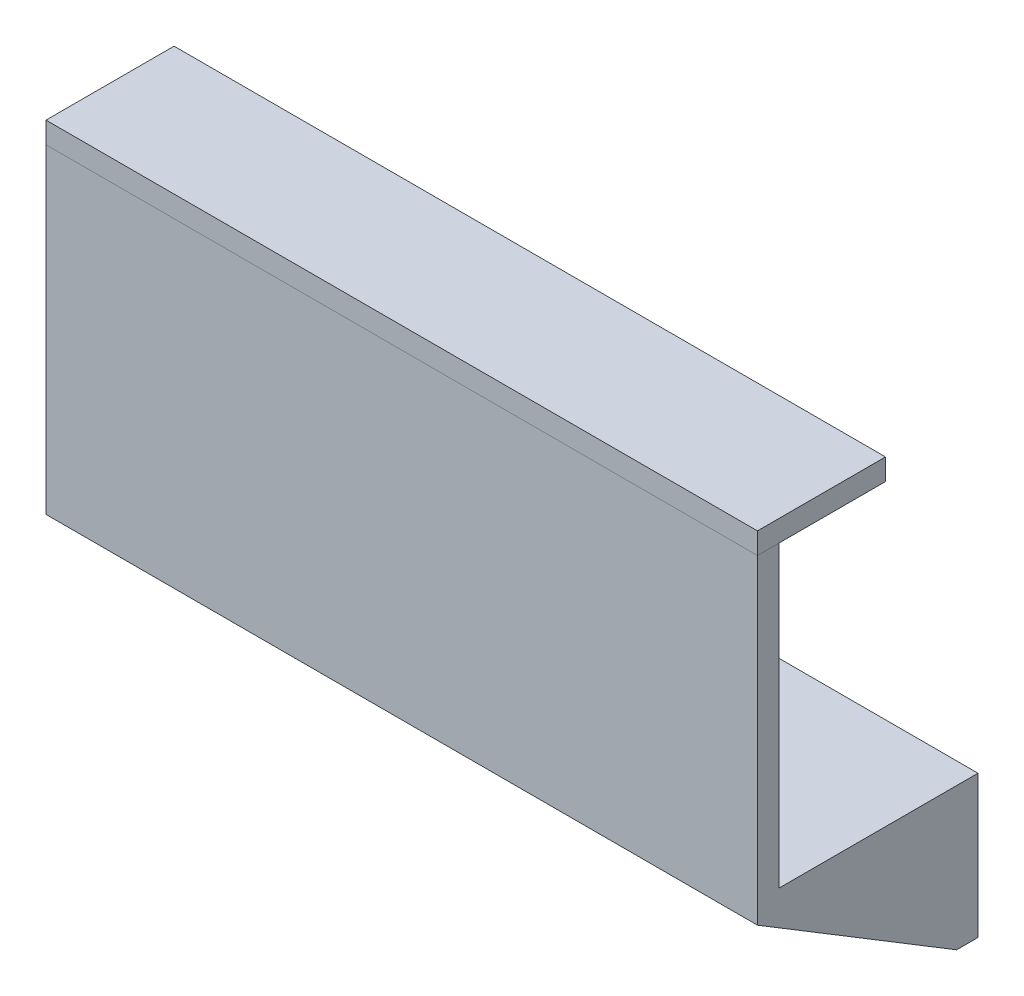
ISO-10303-21;
HEADER;
FILE_DESCRIPTION(('STEP AP214'),'2;1');
FILE_NAME('part.step','',(''),(''),'','','');
FILE_SCHEMA(('AUTOMOTIVE_DESIGN { 1 0 10303 214 1 1 1 1 }'));
ENDSEC;
DATA;
#1=APPLICATION_CONTEXT('core data for automotive mechanical design processes');
#2=APPLICATION_PROTOCOL_DEFINITION('international standard','automotive_design',2000,#1);
#3=PRODUCT_CONTEXT('',#1,'mechanical');
#4=PRODUCT('Part','Part','',(#3));
#5=PRODUCT_RELATED_PRODUCT_CATEGORY('part','',(#4));
#6=PRODUCT_DEFINITION_FORMATION('','',#4);
#7=PRODUCT_DEFINITION_CONTEXT('part definition',#1,'design');
#8=PRODUCT_DEFINITION('design','',#6,#7);
#9=PRODUCT_DEFINITION_SHAPE('','',#8);
#10=(LENGTH_UNIT() NAMED_UNIT(*) SI_UNIT(.MILLI.,.METRE.));
#11=(NAMED_UNIT(*) PLANE_ANGLE_UNIT() SI_UNIT($,.RADIAN.));
#12=(NAMED_UNIT(*) SI_UNIT($,.STERADIAN.) SOLID_ANGLE_UNIT());
#13=UNCERTAINTY_MEASURE_WITH_UNIT(LENGTH_MEASURE(1.E-05),#10,'distance_accuracy_value','');
#14=(GEOMETRIC_REPRESENTATION_CONTEXT(3) GLOBAL_UNCERTAINTY_ASSIGNED_CONTEXT((#13)) GLOBAL_UNIT_ASSIGNED_CONTEXT((#10,
#11,#12)) REPRESENTATION_CONTEXT('',''));
#15=CARTESIAN_POINT('',(0.,0.,0.));
#16=DIRECTION('',(0.,0.,1.));
#17=DIRECTION('',(1.,0.,0.));
#18=AXIS2_PLACEMENT_3D('',#15,#16,#17);
#19=CARTESIAN_POINT('',(2.,-3.,3.));
#20=DIRECTION('',(0.,0.,-1.));
#21=DIRECTION('',(-1.,0.,0.));
#22=AXIS2_PLACEMENT_3D('',#19,#20,#21);
#23=PLANE('',#22);
#24=DIRECTION('',(0.,-1.,0.));
#25=VECTOR('',#24,1.);
#26=CARTESIAN_POINT('',(0.,-3.,3.));
#27=LINE('',#26,#25);
#28=CARTESIAN_POINT('',(0.,-3.,3.));
#29=VERTEX_POINT('',#28);
#30=CARTESIAN_POINT('',(0.,-20.,3.));
#31=VERTEX_POINT('',#30);
#32=EDGE_CURVE('E104',#29,#31,#27,.T.);
#33=ORIENTED_EDGE('',*,*,#32,.F.);
#34=DIRECTION('',(-1.,0.,0.));
#35=VECTOR('',#34,1.);
#36=CARTESIAN_POINT('',(2.,-3.,3.));
#37=LINE('',#36,#35);
#38=CARTESIAN_POINT('',(2.,-3.,3.));
#39=VERTEX_POINT('',#38);
#40=EDGE_CURVE('E12',#39,#29,#37,.T.);
#41=ORIENTED_EDGE('',*,*,#40,.F.);
#42=DIRECTION('',(0.,-1.,0.));
#43=VECTOR('',#42,1.);
#44=CARTESIAN_POINT('',(2.,-3.,3.));
#45=LINE('',#44,#43);
#46=CARTESIAN_POINT('',(2.,-20.,3.));
#47=VERTEX_POINT('',#46);
#48=EDGE_CURVE('E96',#39,#47,#45,.T.);
#49=ORIENTED_EDGE('',*,*,#48,.T.);
#50=DIRECTION('',(-1.,0.,0.));
#51=VECTOR('',#50,1.);
#52=CARTESIAN_POINT('',(2.,-20.,3.));
#53=LINE('',#52,#51);
#54=EDGE_CURVE('E55',#47,#31,#53,.T.);
#55=ORIENTED_EDGE('',*,*,#54,.T.);
#56=EDGE_LOOP('',(#33,#41,#49,#55));
#57=FACE_BOUND('',#56,.T.);
#58=ADVANCED_FACE('F52',(#57),#23,.T.);
#59=CARTESIAN_POINT('',(2.,-3.,31.));
#60=DIRECTION('',(0.,1.,0.));
#61=DIRECTION('',(-1.,0.,0.));
#62=AXIS2_PLACEMENT_3D('',#59,#60,#61);
#63=PLANE('',#62);
#64=DIRECTION('',(0.,0.,-1.));
#65=VECTOR('',#64,1.);
#66=CARTESIAN_POINT('',(0.,-3.,31.));
#67=LINE('',#66,#65);
#68=CARTESIAN_POINT('',(0.,-3.,31.));
#69=VERTEX_POINT('',#68);
#70=EDGE_CURVE('E98',#69,#29,#67,.T.);
#71=ORIENTED_EDGE('',*,*,#70,.F.);
#72=DIRECTION('',(-1.,0.,0.));
#73=VECTOR('',#72,1.);
#74=CARTESIAN_POINT('',(2.,-3.,31.));
#75=LINE('',#74,#73);
#76=CARTESIAN_POINT('',(2.,-3.,31.));
#77=VERTEX_POINT('',#76);
#78=EDGE_CURVE('E61',#77,#69,#75,.T.);
#79=ORIENTED_EDGE('',*,*,#78,.F.);
#80=DIRECTION('',(0.,0.,-1.));
#81=VECTOR('',#80,1.);
#82=CARTESIAN_POINT('',(2.,-3.,31.));
#83=LINE('',#82,#81);
#84=EDGE_CURVE('E93',#77,#39,#83,.T.);
#85=ORIENTED_EDGE('',*,*,#84,.T.);
#86=ORIENTED_EDGE('',*,*,#40,.T.);
#87=EDGE_LOOP('',(#71,#79,#85,#86));
#88=FACE_BOUND('',#87,.T.);
#89=ADVANCED_FACE('F108',(#88),#63,.T.);
#90=CARTESIAN_POINT('',(2.,-20.,3.));
#91=DIRECTION('',(0.,-0.854787515221729,0.518978134241764));
#92=DIRECTION('',(0.,-0.518978134241764,-0.854787515221729));
#93=AXIS2_PLACEMENT_3D('',#90,#91,#92);
#94=PLANE('',#93);
#95=DIRECTION('',(0.,0.518978134241764,0.854787515221729));
#96=VECTOR('',#95,1.);
#97=CARTESIAN_POINT('',(0.,-20.,3.));
#98=LINE('',#97,#96);
#99=EDGE_CURVE('E91',#31,#69,#98,.T.);
#100=ORIENTED_EDGE('',*,*,#99,.F.);
#101=ORIENTED_EDGE('',*,*,#54,.F.);
#102=DIRECTION('',(0.,0.518978134241764,0.854787515221729));
#103=VECTOR('',#102,1.);
#104=CARTESIAN_POINT('',(2.,-20.,3.));
#105=LINE('',#104,#103);
#106=EDGE_CURVE('E89',#47,#77,#105,.T.);
#107=ORIENTED_EDGE('',*,*,#106,.T.);
#108=ORIENTED_EDGE('',*,*,#78,.T.);
#109=EDGE_LOOP('',(#100,#101,#107,#108));
#110=FACE_BOUND('',#109,.T.);
#111=ADVANCED_FACE('F88',(#110),#94,.T.);
#112=CARTESIAN_POINT('',(2.,0.,0.));
#113=DIRECTION('',(1.,0.,0.));
#114=DIRECTION('',(0.,1.,0.));
#115=AXIS2_PLACEMENT_3D('',#112,#113,#114);
#116=PLANE('',#115);
#117=ORIENTED_EDGE('',*,*,#48,.F.);
#118=ORIENTED_EDGE('',*,*,#84,.F.);
#119=ORIENTED_EDGE('',*,*,#106,.F.);
#120=EDGE_LOOP('',(#117,#118,#119));
#121=FACE_BOUND('',#120,.T.);
#122=ADVANCED_FACE('F95',(#121),#116,.T.);
#123=CARTESIAN_POINT('',(0.,0.,0.));
#124=DIRECTION('',(1.,0.,0.));
#125=DIRECTION('',(0.,1.,0.));
#126=AXIS2_PLACEMENT_3D('',#123,#124,#125);
#127=PLANE('',#126);
#128=ORIENTED_EDGE('',*,*,#32,.T.);
#129=ORIENTED_EDGE('',*,*,#99,.T.);
#130=ORIENTED_EDGE('',*,*,#70,.T.);
#131=EDGE_LOOP('',(#128,#129,#130));
#132=FACE_BOUND('',#131,.T.);
#133=ADVANCED_FACE('F107',(#132),#127,.F.);
#134=CLOSED_SHELL('',(#58,#89,#111,#122,#133));
#135=MANIFOLD_SOLID_BREP('B2',#134);
#136=CARTESIAN_POINT('',(100.,42.,31.));
#137=DIRECTION('',(1.,0.,0.));
#138=DIRECTION('',(0.,0.,-1.));
#139=AXIS2_PLACEMENT_3D('',#136,#137,#138);
#140=PLANE('',#139);
#141=DIRECTION('',(0.,0.,-1.));
#142=VECTOR('',#141,1.);
#143=CARTESIAN_POINT('',(100.,42.,31.));
#144=LINE('',#143,#142);
#145=CARTESIAN_POINT('',(100.,42.,31.));
#146=VERTEX_POINT('',#145);
#147=CARTESIAN_POINT('',(100.,42.,13.));
#148=VERTEX_POINT('',#147);
#149=EDGE_CURVE('E152',#146,#148,#144,.T.);
#150=ORIENTED_EDGE('',*,*,#149,.T.);
#151=DIRECTION('',(0.,-1.,0.));
#152=VECTOR('',#151,1.);
#153=CARTESIAN_POINT('',(100.,42.,13.));
#154=LINE('',#153,#152);
#155=CARTESIAN_POINT('',(100.,45.,13.));
#156=VERTEX_POINT('',#155);
#157=EDGE_CURVE('E189',#156,#148,#154,.T.);
#158=ORIENTED_EDGE('',*,*,#157,.F.);
#159=DIRECTION('',(0.,0.,-1.));
#160=VECTOR('',#159,1.);
#161=CARTESIAN_POINT('',(100.,45.,31.));
#162=LINE('',#161,#160);
#163=CARTESIAN_POINT('',(100.,45.,31.));
#164=VERTEX_POINT('',#163);
#165=EDGE_CURVE('E50',#164,#156,#162,.T.);
#166=ORIENTED_EDGE('',*,*,#165,.F.);
#167=DIRECTION('',(0.,-1.,0.));
#168=VECTOR('',#167,1.);
#169=CARTESIAN_POINT('',(100.,42.,31.));
#170=LINE('',#169,#168);
#171=EDGE_CURVE('E190',#164,#146,#170,.T.);
#172=ORIENTED_EDGE('',*,*,#171,.T.);
#173=EDGE_LOOP('',(#150,#158,#166,#172));
#174=FACE_BOUND('',#173,.T.);
#175=ADVANCED_FACE('F149',(#174),#140,.T.);
#176=CARTESIAN_POINT('',(100.,45.,31.));
#177=DIRECTION('',(0.,1.,0.));
#178=DIRECTION('',(-1.,0.,0.));
#179=AXIS2_PLACEMENT_3D('',#176,#177,#178);
#180=PLANE('',#179);
#181=ORIENTED_EDGE('',*,*,#165,.T.);
#182=DIRECTION('',(1.,0.,0.));
#183=VECTOR('',#182,1.);
#184=CARTESIAN_POINT('',(100.,45.,13.));
#185=LINE('',#184,#183);
#186=CARTESIAN_POINT('',(0.,45.,13.));
#187=VERTEX_POINT('',#186);
#188=EDGE_CURVE('E206',#187,#156,#185,.T.);
#189=ORIENTED_EDGE('',*,*,#188,.F.);
#190=DIRECTION('',(0.,0.,-1.));
#191=VECTOR('',#190,1.);
#192=CARTESIAN_POINT('',(0.,45.,31.));
#193=LINE('',#192,#191);
#194=CARTESIAN_POINT('',(0.,45.,31.));
#195=VERTEX_POINT('',#194);
#196=EDGE_CURVE('E157',#195,#187,#193,.T.);
#197=ORIENTED_EDGE('',*,*,#196,.F.);
#198=DIRECTION('',(1.,0.,0.));
#199=VECTOR('',#198,1.);
#200=CARTESIAN_POINT('',(100.,45.,31.));
#201=LINE('',#200,#199);
#202=EDGE_CURVE('E195',#195,#164,#201,.T.);
#203=ORIENTED_EDGE('',*,*,#202,.T.);
#204=EDGE_LOOP('',(#181,#189,#197,#203));
#205=FACE_BOUND('',#204,.T.);
#206=ADVANCED_FACE('F221',(#205),#180,.T.);
#207=CARTESIAN_POINT('',(0.,42.,31.));
#208=DIRECTION('',(-1.,0.,0.));
#209=DIRECTION('',(0.,-1.,0.));
#210=AXIS2_PLACEMENT_3D('',#207,#208,#209);
#211=PLANE('',#210);
#212=ORIENTED_EDGE('',*,*,#196,.T.);
#213=DIRECTION('',(0.,1.,0.));
#214=VECTOR('',#213,1.);
#215=CARTESIAN_POINT('',(0.,42.,13.));
#216=LINE('',#215,#214);
#217=CARTESIAN_POINT('',(0.,42.,13.));
#218=VERTEX_POINT('',#217);
#219=EDGE_CURVE('E202',#218,#187,#216,.T.);
#220=ORIENTED_EDGE('',*,*,#219,.F.);
#221=DIRECTION('',(0.,0.,-1.));
#222=VECTOR('',#221,1.);
#223=CARTESIAN_POINT('',(0.,42.,31.));
#224=LINE('',#223,#222);
#225=CARTESIAN_POINT('',(0.,42.,31.));
#226=VERTEX_POINT('',#225);
#227=EDGE_CURVE('E194',#226,#218,#224,.T.);
#228=ORIENTED_EDGE('',*,*,#227,.F.);
#229=DIRECTION('',(0.,1.,0.));
#230=VECTOR('',#229,1.);
#231=CARTESIAN_POINT('',(0.,42.,31.));
#232=LINE('',#231,#230);
#233=EDGE_CURVE('E214',#226,#195,#232,.T.);
#234=ORIENTED_EDGE('',*,*,#233,.T.);
#235=EDGE_LOOP('',(#212,#220,#228,#234));
#236=FACE_BOUND('',#235,.T.);
#237=ADVANCED_FACE('F218',(#236),#211,.T.);
#238=CARTESIAN_POINT('',(100.,42.,31.));
#239=DIRECTION('',(0.,-1.,0.));
#240=DIRECTION('',(1.,0.,0.));
#241=AXIS2_PLACEMENT_3D('',#238,#239,#240);
#242=PLANE('',#241);
#243=ORIENTED_EDGE('',*,*,#227,.T.);
#244=DIRECTION('',(-1.,0.,0.));
#245=VECTOR('',#244,1.);
#246=CARTESIAN_POINT('',(100.,42.,13.));
#247=LINE('',#246,#245);
#248=EDGE_CURVE('E197',#148,#218,#247,.T.);
#249=ORIENTED_EDGE('',*,*,#248,.F.);
#250=ORIENTED_EDGE('',*,*,#149,.F.);
#251=DIRECTION('',(-1.,0.,0.));
#252=VECTOR('',#251,1.);
#253=CARTESIAN_POINT('',(100.,42.,31.));
#254=LINE('',#253,#252);
#255=EDGE_CURVE('E212',#146,#226,#254,.T.);
#256=ORIENTED_EDGE('',*,*,#255,.T.);
#257=EDGE_LOOP('',(#243,#249,#250,#256));
#258=FACE_BOUND('',#257,.T.);
#259=ADVANCED_FACE('F198',(#258),#242,.T.);
#260=CARTESIAN_POINT('',(0.,0.,31.));
#261=DIRECTION('',(0.,0.,1.));
#262=DIRECTION('',(1.,0.,0.));
#263=AXIS2_PLACEMENT_3D('',#260,#261,#262);
#264=PLANE('',#263);
#265=ORIENTED_EDGE('',*,*,#171,.F.);
#266=ORIENTED_EDGE('',*,*,#202,.F.);
#267=ORIENTED_EDGE('',*,*,#233,.F.);
#268=ORIENTED_EDGE('',*,*,#255,.F.);
#269=EDGE_LOOP('',(#265,#266,#267,#268));
#270=FACE_BOUND('',#269,.T.);
#271=ADVANCED_FACE('F223',(#270),#264,.T.);
#272=CARTESIAN_POINT('',(0.,0.,13.));
#273=DIRECTION('',(0.,0.,1.));
#274=DIRECTION('',(1.,0.,0.));
#275=AXIS2_PLACEMENT_3D('',#272,#273,#274);
#276=PLANE('',#275);
#277=ORIENTED_EDGE('',*,*,#157,.T.);
#278=ORIENTED_EDGE('',*,*,#248,.T.);
#279=ORIENTED_EDGE('',*,*,#219,.T.);
#280=ORIENTED_EDGE('',*,*,#188,.T.);
#281=EDGE_LOOP('',(#277,#278,#279,#280));
#282=FACE_BOUND('',#281,.T.);
#283=ADVANCED_FACE('F205',(#282),#276,.F.);
#284=CLOSED_SHELL('',(#175,#206,#237,#259,#271,#283));
#285=MANIFOLD_SOLID_BREP('B6',#284);
#286=CARTESIAN_POINT('',(0.,0.,3.));
#287=DIRECTION('',(0.,0.,1.));
#288=DIRECTION('',(1.,0.,0.));
#289=AXIS2_PLACEMENT_3D('',#286,#287,#288);
#290=PLANE('',#289);
#291=CARTESIAN_POINT('',(89.,-6.,3.));
#292=DIRECTION('',(0.,0.,1.));
#293=DIRECTION('',(1.,0.,0.));
#294=AXIS2_PLACEMENT_3D('',#291,#292,#293);
#295=CIRCLE('',#294,1.99999999999997);
#296=CARTESIAN_POINT('',(91.,-6.,3.));
#297=VERTEX_POINT('',#296);
#298=EDGE_CURVE('E270',#297,#297,#295,.F.);
#299=ORIENTED_EDGE('',*,*,#298,.T.);
#300=EDGE_LOOP('',(#299));
#301=FACE_BOUND('',#300,.T.);
#302=CARTESIAN_POINT('',(10.,-6.,3.));
#303=DIRECTION('',(0.,0.,1.));
#304=DIRECTION('',(1.,0.,0.));
#305=AXIS2_PLACEMENT_3D('',#302,#303,#304);
#306=CIRCLE('',#305,1.99999999999998);
#307=CARTESIAN_POINT('',(12.,-6.,3.));
#308=VERTEX_POINT('',#307);
#309=EDGE_CURVE('E349',#308,#308,#306,.F.);
#310=ORIENTED_EDGE('',*,*,#309,.T.);
#311=EDGE_LOOP('',(#310));
#312=FACE_BOUND('',#311,.T.);
#313=DIRECTION('',(1.,0.,0.));
#314=VECTOR('',#313,1.);
#315=CARTESIAN_POINT('',(0.,-20.,3.));
#316=LINE('',#315,#314);
#317=CARTESIAN_POINT('',(0.,-20.,3.));
#318=VERTEX_POINT('',#317);
#319=CARTESIAN_POINT('',(98.,-20.,3.));
#320=VERTEX_POINT('',#319);
#321=EDGE_CURVE('E329',#318,#320,#316,.T.);
#322=ORIENTED_EDGE('',*,*,#321,.T.);
#323=DIRECTION('',(0.,1.,0.));
#324=VECTOR('',#323,1.);
#325=CARTESIAN_POINT('',(98.,-20.,3.));
#326=LINE('',#325,#324);
#327=CARTESIAN_POINT('',(98.,-3.,3.));
#328=VERTEX_POINT('',#327);
#329=EDGE_CURVE('E420',#320,#328,#326,.T.);
#330=ORIENTED_EDGE('',*,*,#329,.T.);
#331=DIRECTION('',(1.,0.,0.));
#332=VECTOR('',#331,1.);
#333=CARTESIAN_POINT('',(0.,-3.,3.));
#334=LINE('',#333,#332);
#335=CARTESIAN_POINT('',(0.,-3.,3.));
#336=VERTEX_POINT('',#335);
#337=EDGE_CURVE('E277',#336,#328,#334,.T.);
#338=ORIENTED_EDGE('',*,*,#337,.F.);
#339=DIRECTION('',(0.,-1.,0.));
#340=VECTOR('',#339,1.);
#341=CARTESIAN_POINT('',(0.,0.,3.));
#342=LINE('',#341,#340);
#343=EDGE_CURVE('E282',#336,#318,#342,.T.);
#344=ORIENTED_EDGE('',*,*,#343,.T.);
#345=EDGE_LOOP('',(#322,#330,#338,#344));
#346=FACE_BOUND('',#345,.T.);
#347=ADVANCED_FACE('F261',(#301,#312,#346),#290,.T.);
#348=CARTESIAN_POINT('',(0.,-3.,28.));
#349=DIRECTION('',(0.,1.,0.));
#350=DIRECTION('',(0.,0.,1.));
#351=AXIS2_PLACEMENT_3D('',#348,#349,#350);
#352=PLANE('',#351);
#353=DIRECTION('',(0.,0.,1.));
#354=VECTOR('',#353,1.);
#355=CARTESIAN_POINT('',(98.,-3.,3.));
#356=LINE('',#355,#354);
#357=CARTESIAN_POINT('',(98.,-3.,31.));
#358=VERTEX_POINT('',#357);
#359=EDGE_CURVE('E418',#328,#358,#356,.T.);
#360=ORIENTED_EDGE('',*,*,#359,.T.);
#361=DIRECTION('',(1.,0.,0.));
#362=VECTOR('',#361,1.);
#363=CARTESIAN_POINT('',(100.,-3.,31.));
#364=LINE('',#363,#362);
#365=CARTESIAN_POINT('',(0.,-3.,31.));
#366=VERTEX_POINT('',#365);
#367=EDGE_CURVE('E432',#366,#358,#364,.T.);
#368=ORIENTED_EDGE('',*,*,#367,.F.);
#369=DIRECTION('',(0.,0.,-1.));
#370=VECTOR('',#369,1.);
#371=CARTESIAN_POINT('',(0.,-3.,28.));
#372=LINE('',#371,#370);
#373=EDGE_CURVE('E463',#366,#336,#372,.T.);
#374=ORIENTED_EDGE('',*,*,#373,.T.);
#375=ORIENTED_EDGE('',*,*,#337,.T.);
#376=EDGE_LOOP('',(#360,#368,#374,#375));
#377=FACE_BOUND('',#376,.T.);
#378=ADVANCED_FACE('F384',(#377),#352,.F.);
#379=CARTESIAN_POINT('',(0.,0.,3.));
#380=DIRECTION('',(1.,0.,0.));
#381=DIRECTION('',(0.,1.,0.));
#382=AXIS2_PLACEMENT_3D('',#379,#380,#381);
#383=PLANE('',#382);
#384=DIRECTION('',(0.,-1.,0.));
#385=VECTOR('',#384,1.);
#386=CARTESIAN_POINT('',(0.,0.,0.));
#387=LINE('',#386,#385);
#388=CARTESIAN_POINT('',(0.,0.,0.));
#389=VERTEX_POINT('',#388);
#390=CARTESIAN_POINT('',(0.,-20.,0.));
#391=VERTEX_POINT('',#390);
#392=EDGE_CURVE('E327',#389,#391,#387,.T.);
#393=ORIENTED_EDGE('',*,*,#392,.T.);
#394=DIRECTION('',(0.,0.,-1.));
#395=VECTOR('',#394,1.);
#396=CARTESIAN_POINT('',(0.,-20.,3.));
#397=LINE('',#396,#395);
#398=EDGE_CURVE('E335',#318,#391,#397,.T.);
#399=ORIENTED_EDGE('',*,*,#398,.F.);
#400=ORIENTED_EDGE('',*,*,#343,.F.);
#401=ORIENTED_EDGE('',*,*,#373,.F.);
#402=DIRECTION('',(0.,-1.,0.));
#403=VECTOR('',#402,1.);
#404=CARTESIAN_POINT('',(0.,-3.,31.));
#405=LINE('',#404,#403);
#406=CARTESIAN_POINT('',(0.,42.,31.));
#407=VERTEX_POINT('',#406);
#408=EDGE_CURVE('E442',#407,#366,#405,.T.);
#409=ORIENTED_EDGE('',*,*,#408,.F.);
#410=DIRECTION('',(0.,0.,-1.));
#411=VECTOR('',#410,1.);
#412=CARTESIAN_POINT('',(0.,42.,31.));
#413=LINE('',#412,#411);
#414=CARTESIAN_POINT('',(0.,42.,28.));
#415=VERTEX_POINT('',#414);
#416=EDGE_CURVE('E443',#407,#415,#413,.T.);
#417=ORIENTED_EDGE('',*,*,#416,.T.);
#418=DIRECTION('',(0.,-1.,0.));
#419=VECTOR('',#418,1.);
#420=CARTESIAN_POINT('',(0.,-3.,28.));
#421=LINE('',#420,#419);
#422=CARTESIAN_POINT('',(0.,0.,28.));
#423=VERTEX_POINT('',#422);
#424=EDGE_CURVE('E456',#415,#423,#421,.T.);
#425=ORIENTED_EDGE('',*,*,#424,.T.);
#426=DIRECTION('',(0.,0.,-1.));
#427=VECTOR('',#426,1.);
#428=CARTESIAN_POINT('',(0.,0.,3.));
#429=LINE('',#428,#427);
#430=EDGE_CURVE('E322',#423,#389,#429,.T.);
#431=ORIENTED_EDGE('',*,*,#430,.T.);
#432=EDGE_LOOP('',(#393,#399,#400,#401,#409,#417,#425,#431));
#433=FACE_BOUND('',#432,.T.);
#434=ADVANCED_FACE('F389',(#433),#383,.F.);
#435=CARTESIAN_POINT('',(0.,-20.,3.));
#436=DIRECTION('',(0.,1.,0.));
#437=DIRECTION('',(0.,0.,1.));
#438=AXIS2_PLACEMENT_3D('',#435,#436,#437);
#439=PLANE('',#438);
#440=DIRECTION('',(1.,0.,0.));
#441=VECTOR('',#440,1.);
#442=CARTESIAN_POINT('',(0.,-20.,0.));
#443=LINE('',#442,#441);
#444=CARTESIAN_POINT('',(100.,-20.,0.));
#445=VERTEX_POINT('',#444);
#446=EDGE_CURVE('E313',#391,#445,#443,.T.);
#447=ORIENTED_EDGE('',*,*,#446,.T.);
#448=DIRECTION('',(0.,0.,-1.));
#449=VECTOR('',#448,1.);
#450=CARTESIAN_POINT('',(100.,-20.,3.));
#451=LINE('',#450,#449);
#452=CARTESIAN_POINT('',(100.,-20.,3.));
#453=VERTEX_POINT('',#452);
#454=EDGE_CURVE('E309',#453,#445,#451,.T.);
#455=ORIENTED_EDGE('',*,*,#454,.F.);
#456=DIRECTION('',(1.,0.,0.));
#457=VECTOR('',#456,1.);
#458=CARTESIAN_POINT('',(98.,-20.,3.));
#459=LINE('',#458,#457);
#460=EDGE_CURVE('E433',#320,#453,#459,.T.);
#461=ORIENTED_EDGE('',*,*,#460,.F.);
#462=ORIENTED_EDGE('',*,*,#321,.F.);
#463=ORIENTED_EDGE('',*,*,#398,.T.);
#464=EDGE_LOOP('',(#447,#455,#461,#462,#463));
#465=FACE_BOUND('',#464,.T.);
#466=ADVANCED_FACE('F468',(#465),#439,.F.);
#467=CARTESIAN_POINT('',(100.,0.,3.));
#468=DIRECTION('',(-1.,0.,0.));
#469=DIRECTION('',(0.,0.,1.));
#470=AXIS2_PLACEMENT_3D('',#467,#468,#469);
#471=PLANE('',#470);
#472=DIRECTION('',(0.,1.,0.));
#473=VECTOR('',#472,1.);
#474=CARTESIAN_POINT('',(100.,0.,0.));
#475=LINE('',#474,#473);
#476=CARTESIAN_POINT('',(100.,0.,0.));
#477=VERTEX_POINT('',#476);
#478=EDGE_CURVE('E301',#445,#477,#475,.T.);
#479=ORIENTED_EDGE('',*,*,#478,.T.);
#480=DIRECTION('',(0.,0.,-1.));
#481=VECTOR('',#480,1.);
#482=CARTESIAN_POINT('',(100.,0.,3.));
#483=LINE('',#482,#481);
#484=CARTESIAN_POINT('',(100.,0.,28.));
#485=VERTEX_POINT('',#484);
#486=EDGE_CURVE('E305',#485,#477,#483,.T.);
#487=ORIENTED_EDGE('',*,*,#486,.F.);
#488=DIRECTION('',(0.,1.,0.));
#489=VECTOR('',#488,1.);
#490=CARTESIAN_POINT('',(100.,-3.,28.));
#491=LINE('',#490,#489);
#492=CARTESIAN_POINT('',(100.,42.,28.));
#493=VERTEX_POINT('',#492);
#494=EDGE_CURVE('E346',#485,#493,#491,.T.);
#495=ORIENTED_EDGE('',*,*,#494,.T.);
#496=DIRECTION('',(0.,0.,-1.));
#497=VECTOR('',#496,1.);
#498=CARTESIAN_POINT('',(100.,42.,31.));
#499=LINE('',#498,#497);
#500=CARTESIAN_POINT('',(100.,42.,31.));
#501=VERTEX_POINT('',#500);
#502=EDGE_CURVE('E446',#501,#493,#499,.T.);
#503=ORIENTED_EDGE('',*,*,#502,.F.);
#504=DIRECTION('',(0.,1.,0.));
#505=VECTOR('',#504,1.);
#506=CARTESIAN_POINT('',(100.,-3.,31.));
#507=LINE('',#506,#505);
#508=CARTESIAN_POINT('',(100.,-3.,31.));
#509=VERTEX_POINT('',#508);
#510=EDGE_CURVE('E458',#509,#501,#507,.T.);
#511=ORIENTED_EDGE('',*,*,#510,.F.);
#512=DIRECTION('',(0.,-0.518978134241764,-0.854787515221729));
#513=VECTOR('',#512,1.);
#514=CARTESIAN_POINT('',(100.,-3.,31.));
#515=LINE('',#514,#513);
#516=EDGE_CURVE('E426',#509,#453,#515,.T.);
#517=ORIENTED_EDGE('',*,*,#516,.T.);
#518=ORIENTED_EDGE('',*,*,#454,.T.);
#519=EDGE_LOOP('',(#479,#487,#495,#503,#511,#517,#518));
#520=FACE_BOUND('',#519,.T.);
#521=ADVANCED_FACE('F303',(#520),#471,.F.);
#522=CARTESIAN_POINT('',(0.,0.,3.));
#523=DIRECTION('',(0.,-1.,0.));
#524=DIRECTION('',(0.,0.,-1.));
#525=AXIS2_PLACEMENT_3D('',#522,#523,#524);
#526=PLANE('',#525);
#527=DIRECTION('',(-1.,0.,0.));
#528=VECTOR('',#527,1.);
#529=CARTESIAN_POINT('',(0.,0.,0.));
#530=LINE('',#529,#528);
#531=EDGE_CURVE('E312',#477,#389,#530,.T.);
#532=ORIENTED_EDGE('',*,*,#531,.T.);
#533=ORIENTED_EDGE('',*,*,#430,.F.);
#534=DIRECTION('',(-1.,0.,0.));
#535=VECTOR('',#534,1.);
#536=CARTESIAN_POINT('',(0.,0.,28.));
#537=LINE('',#536,#535);
#538=EDGE_CURVE('E320',#485,#423,#537,.T.);
#539=ORIENTED_EDGE('',*,*,#538,.F.);
#540=ORIENTED_EDGE('',*,*,#486,.T.);
#541=EDGE_LOOP('',(#532,#533,#539,#540));
#542=FACE_BOUND('',#541,.T.);
#543=ADVANCED_FACE('F316',(#542),#526,.F.);
#544=CARTESIAN_POINT('',(0.,0.,0.));
#545=DIRECTION('',(0.,0.,1.));
#546=DIRECTION('',(1.,0.,0.));
#547=AXIS2_PLACEMENT_3D('',#544,#545,#546);
#548=PLANE('',#547);
#549=CARTESIAN_POINT('',(10.,-6.,0.));
#550=DIRECTION('',(0.,0.,1.));
#551=DIRECTION('',(1.,0.,0.));
#552=AXIS2_PLACEMENT_3D('',#549,#550,#551);
#553=CIRCLE('',#552,1.5);
#554=CARTESIAN_POINT('',(11.5,-6.,0.));
#555=VERTEX_POINT('',#554);
#556=EDGE_CURVE('E342',#555,#555,#553,.T.);
#557=ORIENTED_EDGE('',*,*,#556,.T.);
#558=EDGE_LOOP('',(#557));
#559=FACE_BOUND('',#558,.T.);
#560=CARTESIAN_POINT('',(89.,-6.,0.));
#561=DIRECTION('',(0.,0.,1.));
#562=DIRECTION('',(1.,0.,0.));
#563=AXIS2_PLACEMENT_3D('',#560,#561,#562);
#564=CIRCLE('',#563,1.5);
#565=CARTESIAN_POINT('',(90.5,-6.,0.));
#566=VERTEX_POINT('',#565);
#567=EDGE_CURVE('E339',#566,#566,#564,.T.);
#568=ORIENTED_EDGE('',*,*,#567,.T.);
#569=EDGE_LOOP('',(#568));
#570=FACE_BOUND('',#569,.T.);
#571=ORIENTED_EDGE('',*,*,#392,.F.);
#572=ORIENTED_EDGE('',*,*,#531,.F.);
#573=ORIENTED_EDGE('',*,*,#478,.F.);
#574=ORIENTED_EDGE('',*,*,#446,.F.);
#575=EDGE_LOOP('',(#571,#572,#573,#574));
#576=FACE_BOUND('',#575,.T.);
#577=ADVANCED_FACE('F325',(#559,#570,#576),#548,.F.);
#578=CARTESIAN_POINT('',(0.,0.,28.));
#579=DIRECTION('',(0.,0.,1.));
#580=DIRECTION('',(1.,0.,0.));
#581=AXIS2_PLACEMENT_3D('',#578,#579,#580);
#582=PLANE('',#581);
#583=ORIENTED_EDGE('',*,*,#494,.F.);
#584=ORIENTED_EDGE('',*,*,#538,.T.);
#585=ORIENTED_EDGE('',*,*,#424,.F.);
#586=DIRECTION('',(-1.,0.,0.));
#587=VECTOR('',#586,1.);
#588=CARTESIAN_POINT('',(100.,42.,28.));
#589=LINE('',#588,#587);
#590=EDGE_CURVE('E453',#493,#415,#589,.T.);
#591=ORIENTED_EDGE('',*,*,#590,.F.);
#592=EDGE_LOOP('',(#583,#584,#585,#591));
#593=FACE_BOUND('',#592,.T.);
#594=ADVANCED_FACE('F370',(#593),#582,.F.);
#595=CARTESIAN_POINT('',(100.,42.,31.));
#596=DIRECTION('',(0.,-1.,0.));
#597=DIRECTION('',(1.,0.,0.));
#598=AXIS2_PLACEMENT_3D('',#595,#596,#597);
#599=PLANE('',#598);
#600=ORIENTED_EDGE('',*,*,#590,.T.);
#601=ORIENTED_EDGE('',*,*,#416,.F.);
#602=DIRECTION('',(-1.,0.,0.));
#603=VECTOR('',#602,1.);
#604=CARTESIAN_POINT('',(100.,42.,31.));
#605=LINE('',#604,#603);
#606=EDGE_CURVE('E448',#501,#407,#605,.T.);
#607=ORIENTED_EDGE('',*,*,#606,.F.);
#608=ORIENTED_EDGE('',*,*,#502,.T.);
#609=EDGE_LOOP('',(#600,#601,#607,#608));
#610=FACE_BOUND('',#609,.T.);
#611=ADVANCED_FACE('F377',(#610),#599,.F.);
#612=CARTESIAN_POINT('',(0.,0.,31.));
#613=DIRECTION('',(0.,0.,1.));
#614=DIRECTION('',(1.,0.,0.));
#615=AXIS2_PLACEMENT_3D('',#612,#613,#614);
#616=PLANE('',#615);
#617=ORIENTED_EDGE('',*,*,#510,.T.);
#618=ORIENTED_EDGE('',*,*,#606,.T.);
#619=ORIENTED_EDGE('',*,*,#408,.T.);
#620=ORIENTED_EDGE('',*,*,#367,.T.);
#621=DIRECTION('',(1.,0.,0.));
#622=VECTOR('',#621,1.);
#623=CARTESIAN_POINT('',(98.,-3.,31.));
#624=LINE('',#623,#622);
#625=EDGE_CURVE('E343',#358,#509,#624,.T.);
#626=ORIENTED_EDGE('',*,*,#625,.T.);
#627=EDGE_LOOP('',(#617,#618,#619,#620,#626));
#628=FACE_BOUND('',#627,.T.);
#629=ADVANCED_FACE('F365',(#628),#616,.T.);
#630=CARTESIAN_POINT('',(89.,-6.,-12.));
#631=DIRECTION('',(0.,0.,1.));
#632=DIRECTION('',(1.,0.,0.));
#633=AXIS2_PLACEMENT_3D('',#630,#631,#632);
#634=CYLINDRICAL_SURFACE('',#633,1.5);
#635=CARTESIAN_POINT('',(89.,-6.,2.50000000000002));
#636=DIRECTION('',(0.,0.,1.));
#637=DIRECTION('',(1.,0.,0.));
#638=AXIS2_PLACEMENT_3D('',#635,#636,#637);
#639=CIRCLE('',#638,1.5);
#640=CARTESIAN_POINT('',(90.5,-6.,2.50000000000002));
#641=VERTEX_POINT('',#640);
#642=EDGE_CURVE('E338',#641,#641,#639,.T.);
#643=ORIENTED_EDGE('',*,*,#642,.T.);
#644=EDGE_LOOP('',(#643));
#645=FACE_BOUND('',#644,.T.);
#646=ORIENTED_EDGE('',*,*,#567,.F.);
#647=EDGE_LOOP('',(#646));
#648=FACE_BOUND('',#647,.T.);
#649=ADVANCED_FACE('F362',(#645,#648),#634,.F.);
#650=CARTESIAN_POINT('',(10.,-6.,-12.));
#651=DIRECTION('',(0.,0.,1.));
#652=DIRECTION('',(1.,0.,0.));
#653=AXIS2_PLACEMENT_3D('',#650,#651,#652);
#654=CYLINDRICAL_SURFACE('',#653,1.5);
#655=CARTESIAN_POINT('',(10.,-6.,2.50000000000002));
#656=DIRECTION('',(0.,0.,1.));
#657=DIRECTION('',(1.,0.,0.));
#658=AXIS2_PLACEMENT_3D('',#655,#656,#657);
#659=CIRCLE('',#658,1.5);
#660=CARTESIAN_POINT('',(11.5,-6.,2.50000000000002));
#661=VERTEX_POINT('',#660);
#662=EDGE_CURVE('E147',#661,#661,#659,.T.);
#663=ORIENTED_EDGE('',*,*,#662,.T.);
#664=EDGE_LOOP('',(#663));
#665=FACE_BOUND('',#664,.T.);
#666=ORIENTED_EDGE('',*,*,#556,.F.);
#667=EDGE_LOOP('',(#666));
#668=FACE_BOUND('',#667,.T.);
#669=ADVANCED_FACE('F359',(#665,#668),#654,.F.);
#670=CARTESIAN_POINT('',(89.,-6.,2.50000000000002));
#671=DIRECTION('',(0.,0.,1.));
#672=DIRECTION('',(1.,0.,0.));
#673=AXIS2_PLACEMENT_3D('',#670,#671,#672);
#674=CONICAL_SURFACE('',#673,1.5,0.785398163397444);
#675=ORIENTED_EDGE('',*,*,#298,.F.);
#676=EDGE_LOOP('',(#675));
#677=FACE_BOUND('',#676,.T.);
#678=ORIENTED_EDGE('',*,*,#642,.F.);
#679=EDGE_LOOP('',(#678));
#680=FACE_BOUND('',#679,.T.);
#681=ADVANCED_FACE('F356',(#677,#680),#674,.F.);
#682=CARTESIAN_POINT('',(10.,-6.,2.50000000000002));
#683=DIRECTION('',(0.,0.,1.));
#684=DIRECTION('',(1.,0.,0.));
#685=AXIS2_PLACEMENT_3D('',#682,#683,#684);
#686=CONICAL_SURFACE('',#685,1.5,0.785398163397446);
#687=ORIENTED_EDGE('',*,*,#309,.F.);
#688=EDGE_LOOP('',(#687));
#689=FACE_BOUND('',#688,.T.);
#690=ORIENTED_EDGE('',*,*,#662,.F.);
#691=EDGE_LOOP('',(#690));
#692=FACE_BOUND('',#691,.T.);
#693=ADVANCED_FACE('F264',(#689,#692),#686,.F.);
#694=CARTESIAN_POINT('',(98.,-3.,31.));
#695=DIRECTION('',(0.,-0.854787515221729,0.518978134241764));
#696=DIRECTION('',(0.,-0.518978134241764,-0.854787515221729));
#697=AXIS2_PLACEMENT_3D('',#694,#695,#696);
#698=PLANE('',#697);
#699=ORIENTED_EDGE('',*,*,#516,.F.);
#700=ORIENTED_EDGE('',*,*,#625,.F.);
#701=DIRECTION('',(0.,-0.518978134241764,-0.854787515221729));
#702=VECTOR('',#701,1.);
#703=CARTESIAN_POINT('',(98.,-3.,31.));
#704=LINE('',#703,#702);
#705=EDGE_CURVE('E415',#358,#320,#704,.T.);
#706=ORIENTED_EDGE('',*,*,#705,.T.);
#707=ORIENTED_EDGE('',*,*,#460,.T.);
#708=EDGE_LOOP('',(#699,#700,#706,#707));
#709=FACE_BOUND('',#708,.T.);
#710=ADVANCED_FACE('F401',(#709),#698,.T.);
#711=CARTESIAN_POINT('',(98.,0.,0.));
#712=DIRECTION('',(1.,0.,0.));
#713=DIRECTION('',(0.,0.,-1.));
#714=AXIS2_PLACEMENT_3D('',#711,#712,#713);
#715=PLANE('',#714);
#716=ORIENTED_EDGE('',*,*,#705,.F.);
#717=ORIENTED_EDGE('',*,*,#359,.F.);
#718=ORIENTED_EDGE('',*,*,#329,.F.);
#719=EDGE_LOOP('',(#716,#717,#718));
#720=FACE_BOUND('',#719,.T.);
#721=ADVANCED_FACE('F404',(#720),#715,.F.);
#722=CLOSED_SHELL('',(#347,#378,#434,#466,#521,#543,#577,#594,#611,#629,#649,#669,#681,#693,
#710,#721));
#723=MANIFOLD_SOLID_BREP('B44',#722);
#724=ADVANCED_BREP_SHAPE_REPRESENTATION('',(#18,#135,#285,#723),#14);
#725=SHAPE_DEFINITION_REPRESENTATION(#9,#724);
ENDSEC;
END-ISO-10303-21;
